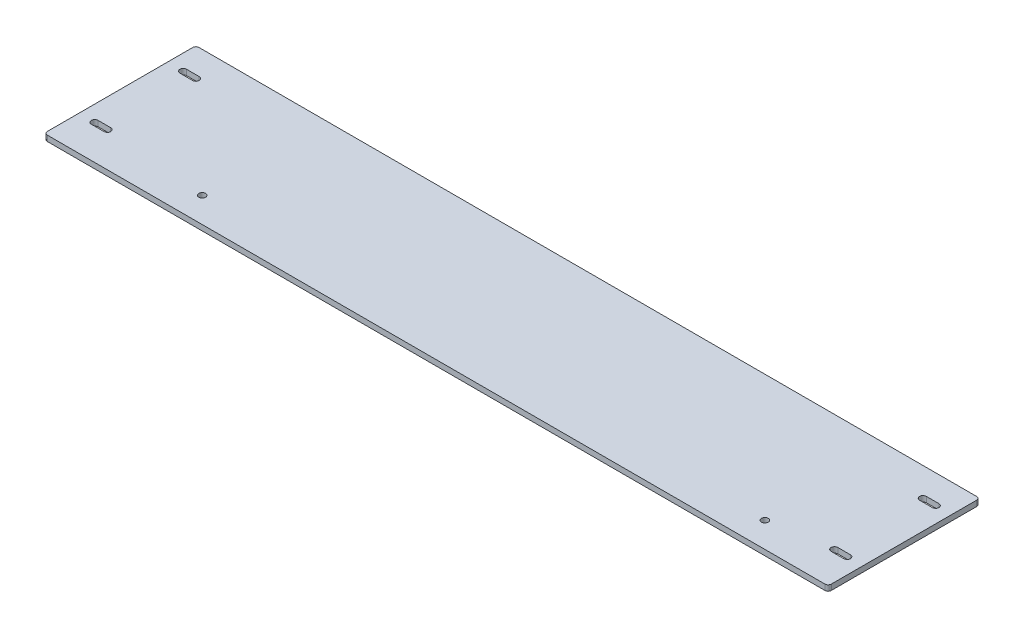
ISO-10303-21;
HEADER;
FILE_DESCRIPTION(('STEP AP214'),'2;1');
FILE_NAME('part.step','',(''),(''),'','','');
FILE_SCHEMA(('AUTOMOTIVE_DESIGN { 1 0 10303 214 1 1 1 1 }'));
ENDSEC;
DATA;
#1=APPLICATION_CONTEXT('core data for automotive mechanical design processes');
#2=APPLICATION_PROTOCOL_DEFINITION('international standard','automotive_design',2000,#1);
#3=PRODUCT_CONTEXT('',#1,'mechanical');
#4=PRODUCT('Part','Part','',(#3));
#5=PRODUCT_RELATED_PRODUCT_CATEGORY('part','',(#4));
#6=PRODUCT_DEFINITION_FORMATION('','',#4);
#7=PRODUCT_DEFINITION_CONTEXT('part definition',#1,'design');
#8=PRODUCT_DEFINITION('design','',#6,#7);
#9=PRODUCT_DEFINITION_SHAPE('','',#8);
#10=(LENGTH_UNIT() NAMED_UNIT(*) SI_UNIT(.MILLI.,.METRE.));
#11=(NAMED_UNIT(*) PLANE_ANGLE_UNIT() SI_UNIT($,.RADIAN.));
#12=(NAMED_UNIT(*) SI_UNIT($,.STERADIAN.) SOLID_ANGLE_UNIT());
#13=UNCERTAINTY_MEASURE_WITH_UNIT(LENGTH_MEASURE(1.E-05),#10,'distance_accuracy_value','');
#14=(GEOMETRIC_REPRESENTATION_CONTEXT(3) GLOBAL_UNCERTAINTY_ASSIGNED_CONTEXT((#13)) GLOBAL_UNIT_ASSIGNED_CONTEXT((#10,
#11,#12)) REPRESENTATION_CONTEXT('',''));
#15=CARTESIAN_POINT('',(0.,0.,0.));
#16=DIRECTION('',(0.,0.,1.));
#17=DIRECTION('',(1.,0.,0.));
#18=AXIS2_PLACEMENT_3D('',#15,#16,#17);
#19=CARTESIAN_POINT('',(0.,5.588,0.));
#20=DIRECTION('',(0.,-1.,0.));
#21=DIRECTION('',(0.,0.,-1.));
#22=AXIS2_PLACEMENT_3D('',#19,#20,#21);
#23=PLANE('',#22);
#24=CARTESIAN_POINT('',(133.35,5.588,-25.4));
#25=DIRECTION('',(0.,1.,0.));
#26=DIRECTION('',(0.,0.,1.));
#27=AXIS2_PLACEMENT_3D('',#24,#25,#26);
#28=CIRCLE('',#27,3.37819999999999);
#29=CARTESIAN_POINT('',(133.35,5.588,-22.0218));
#30=VERTEX_POINT('',#29);
#31=EDGE_CURVE('E851',#30,#30,#28,.T.);
#32=ORIENTED_EDGE('',*,*,#31,.F.);
#33=EDGE_LOOP('',(#32));
#34=FACE_BOUND('',#33,.T.);
#35=CARTESIAN_POINT('',(698.5,5.588,-25.4));
#36=DIRECTION('',(0.,1.,0.));
#37=DIRECTION('',(0.,0.,1.));
#38=AXIS2_PLACEMENT_3D('',#35,#36,#37);
#39=CIRCLE('',#38,3.37819999999999);
#40=CARTESIAN_POINT('',(698.5,5.588,-22.0218));
#41=VERTEX_POINT('',#40);
#42=EDGE_CURVE('E847',#41,#41,#39,.T.);
#43=ORIENTED_EDGE('',*,*,#42,.F.);
#44=EDGE_LOOP('',(#43));
#45=FACE_BOUND('',#44,.T.);
#46=CARTESIAN_POINT('',(771.525,5.588,-123.825));
#47=DIRECTION('',(0.,1.,0.));
#48=DIRECTION('',(0.,0.,1.));
#49=AXIS2_PLACEMENT_3D('',#46,#47,#48);
#50=CIRCLE('',#49,3.37819999999999);
#51=CARTESIAN_POINT('',(771.525,5.588,-120.4468));
#52=VERTEX_POINT('',#51);
#53=CARTESIAN_POINT('',(771.525,5.588,-127.2032));
#54=VERTEX_POINT('',#53);
#55=EDGE_CURVE('E257',#52,#54,#50,.T.);
#56=ORIENTED_EDGE('',*,*,#55,.F.);
#57=DIRECTION('',(1.,0.,0.));
#58=VECTOR('',#57,1.);
#59=CARTESIAN_POINT('',(771.525,5.588,-120.4468));
#60=LINE('',#59,#58);
#61=CARTESIAN_POINT('',(758.825,5.588,-120.4468));
#62=VERTEX_POINT('',#61);
#63=EDGE_CURVE('E268',#62,#52,#60,.T.);
#64=ORIENTED_EDGE('',*,*,#63,.F.);
#65=CARTESIAN_POINT('',(758.825,5.588,-123.825));
#66=DIRECTION('',(0.,1.,0.));
#67=DIRECTION('',(0.,0.,1.));
#68=AXIS2_PLACEMENT_3D('',#65,#66,#67);
#69=CIRCLE('',#68,3.37819999999999);
#70=CARTESIAN_POINT('',(758.825,5.588,-127.2032));
#71=VERTEX_POINT('',#70);
#72=EDGE_CURVE('E264',#71,#62,#69,.T.);
#73=ORIENTED_EDGE('',*,*,#72,.F.);
#74=DIRECTION('',(-1.,0.,0.));
#75=VECTOR('',#74,1.);
#76=CARTESIAN_POINT('',(771.525,5.588,-127.2032));
#77=LINE('',#76,#75);
#78=EDGE_CURVE('E260',#54,#71,#77,.T.);
#79=ORIENTED_EDGE('',*,*,#78,.F.);
#80=EDGE_LOOP('',(#56,#64,#73,#79));
#81=FACE_BOUND('',#80,.T.);
#82=CARTESIAN_POINT('',(15.875,5.588,-34.925));
#83=DIRECTION('',(0.,1.,0.));
#84=DIRECTION('',(0.,0.,1.));
#85=AXIS2_PLACEMENT_3D('',#82,#83,#84);
#86=CIRCLE('',#85,3.3782);
#87=CARTESIAN_POINT('',(15.875,5.588,-38.3032));
#88=VERTEX_POINT('',#87);
#89=CARTESIAN_POINT('',(15.875,5.588,-31.5468));
#90=VERTEX_POINT('',#89);
#91=EDGE_CURVE('E343',#88,#90,#86,.T.);
#92=ORIENTED_EDGE('',*,*,#91,.F.);
#93=DIRECTION('',(-1.,0.,0.));
#94=VECTOR('',#93,1.);
#95=CARTESIAN_POINT('',(15.875,5.588,-38.3032));
#96=LINE('',#95,#94);
#97=CARTESIAN_POINT('',(28.575,5.588,-38.3032));
#98=VERTEX_POINT('',#97);
#99=EDGE_CURVE('E354',#98,#88,#96,.T.);
#100=ORIENTED_EDGE('',*,*,#99,.F.);
#101=CARTESIAN_POINT('',(28.575,5.588,-34.925));
#102=DIRECTION('',(0.,1.,0.));
#103=DIRECTION('',(0.,0.,1.));
#104=AXIS2_PLACEMENT_3D('',#101,#102,#103);
#105=CIRCLE('',#104,3.3782);
#106=CARTESIAN_POINT('',(28.575,5.588,-31.5468));
#107=VERTEX_POINT('',#106);
#108=EDGE_CURVE('E350',#107,#98,#105,.T.);
#109=ORIENTED_EDGE('',*,*,#108,.F.);
#110=DIRECTION('',(1.,0.,0.));
#111=VECTOR('',#110,1.);
#112=CARTESIAN_POINT('',(15.875,5.588,-31.5468));
#113=LINE('',#112,#111);
#114=EDGE_CURVE('E346',#90,#107,#113,.T.);
#115=ORIENTED_EDGE('',*,*,#114,.F.);
#116=EDGE_LOOP('',(#92,#100,#109,#115));
#117=FACE_BOUND('',#116,.T.);
#118=DIRECTION('',(-1.,0.,0.));
#119=VECTOR('',#118,1.);
#120=CARTESIAN_POINT('',(0.,5.588,-152.4));
#121=LINE('',#120,#119);
#122=CARTESIAN_POINT('',(784.225,5.588,-152.4));
#123=VERTEX_POINT('',#122);
#124=CARTESIAN_POINT('',(3.175,5.588,-152.4));
#125=VERTEX_POINT('',#124);
#126=EDGE_CURVE('E397',#123,#125,#121,.T.);
#127=ORIENTED_EDGE('',*,*,#126,.T.);
#128=CARTESIAN_POINT('',(3.175,5.588,-149.225));
#129=DIRECTION('',(0.,-1.,0.));
#130=DIRECTION('',(0.,0.,-1.));
#131=AXIS2_PLACEMENT_3D('',#128,#129,#130);
#132=CIRCLE('',#131,3.175);
#133=CARTESIAN_POINT('',(0.,5.588,-149.225));
#134=VERTEX_POINT('',#133);
#135=EDGE_CURVE('E448',#125,#134,#132,.F.);
#136=ORIENTED_EDGE('',*,*,#135,.T.);
#137=DIRECTION('',(0.,0.,1.));
#138=VECTOR('',#137,1.);
#139=CARTESIAN_POINT('',(0.,5.588,0.));
#140=LINE('',#139,#138);
#141=CARTESIAN_POINT('',(0.,5.588,-3.175));
#142=VERTEX_POINT('',#141);
#143=EDGE_CURVE('E386',#134,#142,#140,.T.);
#144=ORIENTED_EDGE('',*,*,#143,.T.);
#145=CARTESIAN_POINT('',(3.175,5.588,-3.175));
#146=DIRECTION('',(0.,-1.,0.));
#147=DIRECTION('',(0.,0.,-1.));
#148=AXIS2_PLACEMENT_3D('',#145,#146,#147);
#149=CIRCLE('',#148,3.175);
#150=CARTESIAN_POINT('',(3.175,5.588,0.));
#151=VERTEX_POINT('',#150);
#152=EDGE_CURVE('E442',#142,#151,#149,.F.);
#153=ORIENTED_EDGE('',*,*,#152,.T.);
#154=DIRECTION('',(1.,0.,0.));
#155=VECTOR('',#154,1.);
#156=CARTESIAN_POINT('',(0.,5.588,0.));
#157=LINE('',#156,#155);
#158=CARTESIAN_POINT('',(784.225,5.588,0.));
#159=VERTEX_POINT('',#158);
#160=EDGE_CURVE('E390',#151,#159,#157,.T.);
#161=ORIENTED_EDGE('',*,*,#160,.T.);
#162=CARTESIAN_POINT('',(784.225,5.588,-3.175));
#163=DIRECTION('',(0.,-1.,0.));
#164=DIRECTION('',(0.,0.,-1.));
#165=AXIS2_PLACEMENT_3D('',#162,#163,#164);
#166=CIRCLE('',#165,3.175);
#167=CARTESIAN_POINT('',(787.4,5.588,-3.175));
#168=VERTEX_POINT('',#167);
#169=EDGE_CURVE('E59',#159,#168,#166,.F.);
#170=ORIENTED_EDGE('',*,*,#169,.T.);
#171=DIRECTION('',(0.,0.,-1.));
#172=VECTOR('',#171,1.);
#173=CARTESIAN_POINT('',(787.4,5.588,0.));
#174=LINE('',#173,#172);
#175=CARTESIAN_POINT('',(787.4,5.588,-149.225));
#176=VERTEX_POINT('',#175);
#177=EDGE_CURVE('E394',#168,#176,#174,.T.);
#178=ORIENTED_EDGE('',*,*,#177,.T.);
#179=CARTESIAN_POINT('',(784.225,5.588,-149.225));
#180=DIRECTION('',(0.,-1.,0.));
#181=DIRECTION('',(0.,0.,-1.));
#182=AXIS2_PLACEMENT_3D('',#179,#180,#181);
#183=CIRCLE('',#182,3.175);
#184=EDGE_CURVE('E445',#176,#123,#183,.F.);
#185=ORIENTED_EDGE('',*,*,#184,.T.);
#186=EDGE_LOOP('',(#127,#136,#144,#153,#161,#170,#178,#185));
#187=FACE_BOUND('',#186,.T.);
#188=CARTESIAN_POINT('',(15.875,5.588,-123.825));
#189=DIRECTION('',(0.,1.,0.));
#190=DIRECTION('',(0.,0.,1.));
#191=AXIS2_PLACEMENT_3D('',#188,#189,#190);
#192=CIRCLE('',#191,3.37819999999998);
#193=CARTESIAN_POINT('',(15.875,5.588,-127.2032));
#194=VERTEX_POINT('',#193);
#195=CARTESIAN_POINT('',(15.875,5.588,-120.4468));
#196=VERTEX_POINT('',#195);
#197=EDGE_CURVE('E300',#194,#196,#192,.T.);
#198=ORIENTED_EDGE('',*,*,#197,.F.);
#199=DIRECTION('',(-1.,0.,0.));
#200=VECTOR('',#199,1.);
#201=CARTESIAN_POINT('',(15.875,5.588,-127.2032));
#202=LINE('',#201,#200);
#203=CARTESIAN_POINT('',(28.575,5.588,-127.2032));
#204=VERTEX_POINT('',#203);
#205=EDGE_CURVE('E311',#204,#194,#202,.T.);
#206=ORIENTED_EDGE('',*,*,#205,.F.);
#207=CARTESIAN_POINT('',(28.575,5.588,-123.825));
#208=DIRECTION('',(0.,1.,0.));
#209=DIRECTION('',(0.,0.,1.));
#210=AXIS2_PLACEMENT_3D('',#207,#208,#209);
#211=CIRCLE('',#210,3.37819999999998);
#212=CARTESIAN_POINT('',(28.575,5.588,-120.4468));
#213=VERTEX_POINT('',#212);
#214=EDGE_CURVE('E307',#213,#204,#211,.T.);
#215=ORIENTED_EDGE('',*,*,#214,.F.);
#216=DIRECTION('',(1.,0.,0.));
#217=VECTOR('',#216,1.);
#218=CARTESIAN_POINT('',(15.875,5.588,-120.4468));
#219=LINE('',#218,#217);
#220=EDGE_CURVE('E303',#196,#213,#219,.T.);
#221=ORIENTED_EDGE('',*,*,#220,.F.);
#222=EDGE_LOOP('',(#198,#206,#215,#221));
#223=FACE_BOUND('',#222,.T.);
#224=CARTESIAN_POINT('',(771.525,5.588,-34.925));
#225=DIRECTION('',(0.,1.,0.));
#226=DIRECTION('',(0.,0.,1.));
#227=AXIS2_PLACEMENT_3D('',#224,#225,#226);
#228=CIRCLE('',#227,3.3782);
#229=CARTESIAN_POINT('',(771.525,5.588,-31.5468));
#230=VERTEX_POINT('',#229);
#231=CARTESIAN_POINT('',(771.525,5.588,-38.3032));
#232=VERTEX_POINT('',#231);
#233=EDGE_CURVE('E201',#230,#232,#228,.T.);
#234=ORIENTED_EDGE('',*,*,#233,.F.);
#235=DIRECTION('',(1.,0.,0.));
#236=VECTOR('',#235,1.);
#237=CARTESIAN_POINT('',(771.525,5.588,-31.5468));
#238=LINE('',#237,#236);
#239=CARTESIAN_POINT('',(758.825,5.588,-31.5468));
#240=VERTEX_POINT('',#239);
#241=EDGE_CURVE('E231',#240,#230,#238,.T.);
#242=ORIENTED_EDGE('',*,*,#241,.F.);
#243=CARTESIAN_POINT('',(758.825,5.588,-34.925));
#244=DIRECTION('',(0.,1.,0.));
#245=DIRECTION('',(0.,0.,1.));
#246=AXIS2_PLACEMENT_3D('',#243,#244,#245);
#247=CIRCLE('',#246,3.3782);
#248=CARTESIAN_POINT('',(758.825,5.588,-38.3032));
#249=VERTEX_POINT('',#248);
#250=EDGE_CURVE('E226',#249,#240,#247,.T.);
#251=ORIENTED_EDGE('',*,*,#250,.F.);
#252=DIRECTION('',(-1.,0.,0.));
#253=VECTOR('',#252,1.);
#254=CARTESIAN_POINT('',(771.525,5.588,-38.3032));
#255=LINE('',#254,#253);
#256=EDGE_CURVE('E212',#232,#249,#255,.T.);
#257=ORIENTED_EDGE('',*,*,#256,.F.);
#258=EDGE_LOOP('',(#234,#242,#251,#257));
#259=FACE_BOUND('',#258,.T.);
#260=ADVANCED_FACE('F36',(#34,#45,#81,#117,#187,#223,#259),#23,.F.);
#261=CARTESIAN_POINT('',(0.,0.,0.));
#262=DIRECTION('',(0.,-1.,0.));
#263=DIRECTION('',(0.,0.,-1.));
#264=AXIS2_PLACEMENT_3D('',#261,#262,#263);
#265=PLANE('',#264);
#266=CARTESIAN_POINT('',(133.35,0.,-25.4));
#267=DIRECTION('',(0.,1.,0.));
#268=DIRECTION('',(0.,0.,1.));
#269=AXIS2_PLACEMENT_3D('',#266,#267,#268);
#270=CIRCLE('',#269,3.37819999999999);
#271=CARTESIAN_POINT('',(133.35,0.,-22.0218));
#272=VERTEX_POINT('',#271);
#273=EDGE_CURVE('E240',#272,#272,#270,.T.);
#274=ORIENTED_EDGE('',*,*,#273,.T.);
#275=EDGE_LOOP('',(#274));
#276=FACE_BOUND('',#275,.T.);
#277=CARTESIAN_POINT('',(698.5,0.,-25.4));
#278=DIRECTION('',(0.,1.,0.));
#279=DIRECTION('',(0.,0.,1.));
#280=AXIS2_PLACEMENT_3D('',#277,#278,#279);
#281=CIRCLE('',#280,3.37819999999999);
#282=CARTESIAN_POINT('',(698.5,0.,-22.0218));
#283=VERTEX_POINT('',#282);
#284=EDGE_CURVE('E844',#283,#283,#281,.T.);
#285=ORIENTED_EDGE('',*,*,#284,.T.);
#286=EDGE_LOOP('',(#285));
#287=FACE_BOUND('',#286,.T.);
#288=DIRECTION('',(0.,0.,1.));
#289=VECTOR('',#288,1.);
#290=CARTESIAN_POINT('',(0.,0.,0.));
#291=LINE('',#290,#289);
#292=CARTESIAN_POINT('',(0.,0.,-149.225));
#293=VERTEX_POINT('',#292);
#294=CARTESIAN_POINT('',(0.,0.,-3.175));
#295=VERTEX_POINT('',#294);
#296=EDGE_CURVE('E385',#293,#295,#291,.T.);
#297=ORIENTED_EDGE('',*,*,#296,.F.);
#298=CARTESIAN_POINT('',(3.175,0.,-149.225));
#299=DIRECTION('',(0.,-1.,0.));
#300=DIRECTION('',(0.,0.,-1.));
#301=AXIS2_PLACEMENT_3D('',#298,#299,#300);
#302=CIRCLE('',#301,3.175);
#303=CARTESIAN_POINT('',(3.175,0.,-152.4));
#304=VERTEX_POINT('',#303);
#305=EDGE_CURVE('E430',#293,#304,#302,.T.);
#306=ORIENTED_EDGE('',*,*,#305,.T.);
#307=DIRECTION('',(-1.,0.,0.));
#308=VECTOR('',#307,1.);
#309=CARTESIAN_POINT('',(0.,0.,-152.4));
#310=LINE('',#309,#308);
#311=CARTESIAN_POINT('',(784.225,0.,-152.4));
#312=VERTEX_POINT('',#311);
#313=EDGE_CURVE('E391',#312,#304,#310,.T.);
#314=ORIENTED_EDGE('',*,*,#313,.F.);
#315=CARTESIAN_POINT('',(784.225,0.,-149.225));
#316=DIRECTION('',(0.,-1.,0.));
#317=DIRECTION('',(0.,0.,-1.));
#318=AXIS2_PLACEMENT_3D('',#315,#316,#317);
#319=CIRCLE('',#318,3.175);
#320=CARTESIAN_POINT('',(787.4,0.,-149.225));
#321=VERTEX_POINT('',#320);
#322=EDGE_CURVE('E427',#312,#321,#319,.T.);
#323=ORIENTED_EDGE('',*,*,#322,.T.);
#324=DIRECTION('',(0.,0.,-1.));
#325=VECTOR('',#324,1.);
#326=CARTESIAN_POINT('',(787.4,0.,0.));
#327=LINE('',#326,#325);
#328=CARTESIAN_POINT('',(787.4,0.,-3.175));
#329=VERTEX_POINT('',#328);
#330=EDGE_CURVE('E409',#329,#321,#327,.T.);
#331=ORIENTED_EDGE('',*,*,#330,.F.);
#332=CARTESIAN_POINT('',(784.225,0.,-3.175));
#333=DIRECTION('',(0.,-1.,0.));
#334=DIRECTION('',(0.,0.,-1.));
#335=AXIS2_PLACEMENT_3D('',#332,#333,#334);
#336=CIRCLE('',#335,3.175);
#337=CARTESIAN_POINT('',(784.225,0.,0.));
#338=VERTEX_POINT('',#337);
#339=EDGE_CURVE('E421',#329,#338,#336,.T.);
#340=ORIENTED_EDGE('',*,*,#339,.T.);
#341=DIRECTION('',(1.,0.,0.));
#342=VECTOR('',#341,1.);
#343=CARTESIAN_POINT('',(0.,0.,0.));
#344=LINE('',#343,#342);
#345=CARTESIAN_POINT('',(3.175,0.,0.));
#346=VERTEX_POINT('',#345);
#347=EDGE_CURVE('E405',#346,#338,#344,.T.);
#348=ORIENTED_EDGE('',*,*,#347,.F.);
#349=CARTESIAN_POINT('',(3.175,0.,-3.175));
#350=DIRECTION('',(0.,-1.,0.));
#351=DIRECTION('',(0.,0.,-1.));
#352=AXIS2_PLACEMENT_3D('',#349,#350,#351);
#353=CIRCLE('',#352,3.175);
#354=EDGE_CURVE('E424',#346,#295,#353,.T.);
#355=ORIENTED_EDGE('',*,*,#354,.T.);
#356=EDGE_LOOP('',(#297,#306,#314,#323,#331,#340,#348,#355));
#357=FACE_BOUND('',#356,.T.);
#358=DIRECTION('',(-1.,0.,0.));
#359=VECTOR('',#358,1.);
#360=CARTESIAN_POINT('',(15.875,0.,-38.3032));
#361=LINE('',#360,#359);
#362=CARTESIAN_POINT('',(28.575,0.,-38.3032));
#363=VERTEX_POINT('',#362);
#364=CARTESIAN_POINT('',(15.875,0.,-38.3032));
#365=VERTEX_POINT('',#364);
#366=EDGE_CURVE('E347',#363,#365,#361,.T.);
#367=ORIENTED_EDGE('',*,*,#366,.T.);
#368=CARTESIAN_POINT('',(15.875,0.,-34.925));
#369=DIRECTION('',(0.,1.,0.));
#370=DIRECTION('',(0.,0.,1.));
#371=AXIS2_PLACEMENT_3D('',#368,#369,#370);
#372=CIRCLE('',#371,3.3782);
#373=CARTESIAN_POINT('',(15.875,0.,-31.5468));
#374=VERTEX_POINT('',#373);
#375=EDGE_CURVE('E342',#365,#374,#372,.T.);
#376=ORIENTED_EDGE('',*,*,#375,.T.);
#377=DIRECTION('',(1.,0.,0.));
#378=VECTOR('',#377,1.);
#379=CARTESIAN_POINT('',(15.875,0.,-31.5468));
#380=LINE('',#379,#378);
#381=CARTESIAN_POINT('',(28.575,0.,-31.5468));
#382=VERTEX_POINT('',#381);
#383=EDGE_CURVE('E361',#374,#382,#380,.T.);
#384=ORIENTED_EDGE('',*,*,#383,.T.);
#385=CARTESIAN_POINT('',(28.575,0.,-34.925));
#386=DIRECTION('',(0.,1.,0.));
#387=DIRECTION('',(0.,0.,1.));
#388=AXIS2_PLACEMENT_3D('',#385,#386,#387);
#389=CIRCLE('',#388,3.3782);
#390=EDGE_CURVE('E365',#382,#363,#389,.T.);
#391=ORIENTED_EDGE('',*,*,#390,.T.);
#392=EDGE_LOOP('',(#367,#376,#384,#391));
#393=FACE_BOUND('',#392,.T.);
#394=DIRECTION('',(-1.,0.,0.));
#395=VECTOR('',#394,1.);
#396=CARTESIAN_POINT('',(15.875,0.,-127.2032));
#397=LINE('',#396,#395);
#398=CARTESIAN_POINT('',(28.575,0.,-127.2032));
#399=VERTEX_POINT('',#398);
#400=CARTESIAN_POINT('',(15.875,0.,-127.2032));
#401=VERTEX_POINT('',#400);
#402=EDGE_CURVE('E304',#399,#401,#397,.T.);
#403=ORIENTED_EDGE('',*,*,#402,.T.);
#404=CARTESIAN_POINT('',(15.875,0.,-123.825));
#405=DIRECTION('',(0.,1.,0.));
#406=DIRECTION('',(0.,0.,1.));
#407=AXIS2_PLACEMENT_3D('',#404,#405,#406);
#408=CIRCLE('',#407,3.37819999999998);
#409=CARTESIAN_POINT('',(15.875,0.,-120.4468));
#410=VERTEX_POINT('',#409);
#411=EDGE_CURVE('E299',#401,#410,#408,.T.);
#412=ORIENTED_EDGE('',*,*,#411,.T.);
#413=DIRECTION('',(1.,0.,0.));
#414=VECTOR('',#413,1.);
#415=CARTESIAN_POINT('',(15.875,0.,-120.4468));
#416=LINE('',#415,#414);
#417=CARTESIAN_POINT('',(28.575,0.,-120.4468));
#418=VERTEX_POINT('',#417);
#419=EDGE_CURVE('E318',#410,#418,#416,.T.);
#420=ORIENTED_EDGE('',*,*,#419,.T.);
#421=CARTESIAN_POINT('',(28.575,0.,-123.825));
#422=DIRECTION('',(0.,1.,0.));
#423=DIRECTION('',(0.,0.,1.));
#424=AXIS2_PLACEMENT_3D('',#421,#422,#423);
#425=CIRCLE('',#424,3.37819999999998);
#426=EDGE_CURVE('E322',#418,#399,#425,.T.);
#427=ORIENTED_EDGE('',*,*,#426,.T.);
#428=EDGE_LOOP('',(#403,#412,#420,#427));
#429=FACE_BOUND('',#428,.T.);
#430=DIRECTION('',(1.,0.,0.));
#431=VECTOR('',#430,1.);
#432=CARTESIAN_POINT('',(771.525,0.,-120.4468));
#433=LINE('',#432,#431);
#434=CARTESIAN_POINT('',(758.825,0.,-120.4468));
#435=VERTEX_POINT('',#434);
#436=CARTESIAN_POINT('',(771.525,0.,-120.4468));
#437=VERTEX_POINT('',#436);
#438=EDGE_CURVE('E261',#435,#437,#433,.T.);
#439=ORIENTED_EDGE('',*,*,#438,.T.);
#440=CARTESIAN_POINT('',(771.525,0.,-123.825));
#441=DIRECTION('',(0.,1.,0.));
#442=DIRECTION('',(0.,0.,1.));
#443=AXIS2_PLACEMENT_3D('',#440,#441,#442);
#444=CIRCLE('',#443,3.37819999999999);
#445=CARTESIAN_POINT('',(771.525,0.,-127.2032));
#446=VERTEX_POINT('',#445);
#447=EDGE_CURVE('E221',#437,#446,#444,.T.);
#448=ORIENTED_EDGE('',*,*,#447,.T.);
#449=DIRECTION('',(-1.,0.,0.));
#450=VECTOR('',#449,1.);
#451=CARTESIAN_POINT('',(771.525,0.,-127.2032));
#452=LINE('',#451,#450);
#453=CARTESIAN_POINT('',(758.825,0.,-127.2032));
#454=VERTEX_POINT('',#453);
#455=EDGE_CURVE('E275',#446,#454,#452,.T.);
#456=ORIENTED_EDGE('',*,*,#455,.T.);
#457=CARTESIAN_POINT('',(758.825,0.,-123.825));
#458=DIRECTION('',(0.,1.,0.));
#459=DIRECTION('',(0.,0.,1.));
#460=AXIS2_PLACEMENT_3D('',#457,#458,#459);
#461=CIRCLE('',#460,3.37819999999999);
#462=EDGE_CURVE('E279',#454,#435,#461,.T.);
#463=ORIENTED_EDGE('',*,*,#462,.T.);
#464=EDGE_LOOP('',(#439,#448,#456,#463));
#465=FACE_BOUND('',#464,.T.);
#466=DIRECTION('',(1.,0.,0.));
#467=VECTOR('',#466,1.);
#468=CARTESIAN_POINT('',(771.525,0.,-31.5468));
#469=LINE('',#468,#467);
#470=CARTESIAN_POINT('',(758.825,0.,-31.5468));
#471=VERTEX_POINT('',#470);
#472=CARTESIAN_POINT('',(771.525,0.,-31.5468));
#473=VERTEX_POINT('',#472);
#474=EDGE_CURVE('E213',#471,#473,#469,.T.);
#475=ORIENTED_EDGE('',*,*,#474,.T.);
#476=CARTESIAN_POINT('',(771.525,0.,-34.925));
#477=DIRECTION('',(0.,1.,0.));
#478=DIRECTION('',(0.,0.,1.));
#479=AXIS2_PLACEMENT_3D('',#476,#477,#478);
#480=CIRCLE('',#479,3.3782);
#481=CARTESIAN_POINT('',(771.525,0.,-38.3032));
#482=VERTEX_POINT('',#481);
#483=EDGE_CURVE('E237',#473,#482,#480,.T.);
#484=ORIENTED_EDGE('',*,*,#483,.T.);
#485=DIRECTION('',(-1.,0.,0.));
#486=VECTOR('',#485,1.);
#487=CARTESIAN_POINT('',(771.525,0.,-38.3032));
#488=LINE('',#487,#486);
#489=CARTESIAN_POINT('',(758.825,0.,-38.3032));
#490=VERTEX_POINT('',#489);
#491=EDGE_CURVE('E219',#482,#490,#488,.T.);
#492=ORIENTED_EDGE('',*,*,#491,.T.);
#493=CARTESIAN_POINT('',(758.825,0.,-34.925));
#494=DIRECTION('',(0.,1.,0.));
#495=DIRECTION('',(0.,0.,1.));
#496=AXIS2_PLACEMENT_3D('',#493,#494,#495);
#497=CIRCLE('',#496,3.3782);
#498=EDGE_CURVE('E243',#490,#471,#497,.T.);
#499=ORIENTED_EDGE('',*,*,#498,.T.);
#500=EDGE_LOOP('',(#475,#484,#492,#499));
#501=FACE_BOUND('',#500,.T.);
#502=ADVANCED_FACE('F472',(#276,#287,#357,#393,#429,#465,#501),#265,.T.);
#503=CARTESIAN_POINT('',(0.,5.588,0.));
#504=DIRECTION('',(1.,0.,0.));
#505=DIRECTION('',(0.,0.,-1.));
#506=AXIS2_PLACEMENT_3D('',#503,#504,#505);
#507=PLANE('',#506);
#508=ORIENTED_EDGE('',*,*,#143,.F.);
#509=DIRECTION('',(0.,-1.,0.));
#510=VECTOR('',#509,1.);
#511=CARTESIAN_POINT('',(0.,5.588,-149.225));
#512=LINE('',#511,#510);
#513=EDGE_CURVE('E417',#134,#293,#512,.T.);
#514=ORIENTED_EDGE('',*,*,#513,.T.);
#515=ORIENTED_EDGE('',*,*,#296,.T.);
#516=DIRECTION('',(0.,-1.,0.));
#517=VECTOR('',#516,1.);
#518=CARTESIAN_POINT('',(0.,5.588,-3.175));
#519=LINE('',#518,#517);
#520=EDGE_CURVE('E401',#295,#142,#519,.F.);
#521=ORIENTED_EDGE('',*,*,#520,.T.);
#522=EDGE_LOOP('',(#508,#514,#515,#521));
#523=FACE_BOUND('',#522,.T.);
#524=ADVANCED_FACE('F489',(#523),#507,.F.);
#525=CARTESIAN_POINT('',(0.,5.588,0.));
#526=DIRECTION('',(0.,0.,-1.));
#527=DIRECTION('',(-1.,0.,0.));
#528=AXIS2_PLACEMENT_3D('',#525,#526,#527);
#529=PLANE('',#528);
#530=ORIENTED_EDGE('',*,*,#160,.F.);
#531=DIRECTION('',(0.,-1.,0.));
#532=VECTOR('',#531,1.);
#533=CARTESIAN_POINT('',(3.175,5.588,0.));
#534=LINE('',#533,#532);
#535=EDGE_CURVE('E11',#151,#346,#534,.T.);
#536=ORIENTED_EDGE('',*,*,#535,.T.);
#537=ORIENTED_EDGE('',*,*,#347,.T.);
#538=DIRECTION('',(0.,-1.,0.));
#539=VECTOR('',#538,1.);
#540=CARTESIAN_POINT('',(784.225,5.588,0.));
#541=LINE('',#540,#539);
#542=EDGE_CURVE('E45',#338,#159,#541,.F.);
#543=ORIENTED_EDGE('',*,*,#542,.T.);
#544=EDGE_LOOP('',(#530,#536,#537,#543));
#545=FACE_BOUND('',#544,.T.);
#546=ADVANCED_FACE('F461',(#545),#529,.F.);
#547=CARTESIAN_POINT('',(787.4,5.588,0.));
#548=DIRECTION('',(-1.,0.,0.));
#549=DIRECTION('',(0.,0.,1.));
#550=AXIS2_PLACEMENT_3D('',#547,#548,#549);
#551=PLANE('',#550);
#552=ORIENTED_EDGE('',*,*,#330,.T.);
#553=DIRECTION('',(0.,-1.,0.));
#554=VECTOR('',#553,1.);
#555=CARTESIAN_POINT('',(787.4,5.588,-149.225));
#556=LINE('',#555,#554);
#557=EDGE_CURVE('E52',#321,#176,#556,.F.);
#558=ORIENTED_EDGE('',*,*,#557,.T.);
#559=ORIENTED_EDGE('',*,*,#177,.F.);
#560=DIRECTION('',(0.,-1.,0.));
#561=VECTOR('',#560,1.);
#562=CARTESIAN_POINT('',(787.4,5.588,-3.175));
#563=LINE('',#562,#561);
#564=EDGE_CURVE('E451',#168,#329,#563,.T.);
#565=ORIENTED_EDGE('',*,*,#564,.T.);
#566=EDGE_LOOP('',(#552,#558,#559,#565));
#567=FACE_BOUND('',#566,.T.);
#568=ADVANCED_FACE('F469',(#567),#551,.F.);
#569=CARTESIAN_POINT('',(0.,5.588,-152.4));
#570=DIRECTION('',(0.,0.,1.));
#571=DIRECTION('',(1.,0.,0.));
#572=AXIS2_PLACEMENT_3D('',#569,#570,#571);
#573=PLANE('',#572);
#574=ORIENTED_EDGE('',*,*,#313,.T.);
#575=DIRECTION('',(0.,-1.,0.));
#576=VECTOR('',#575,1.);
#577=CARTESIAN_POINT('',(3.175,5.588,-152.4));
#578=LINE('',#577,#576);
#579=EDGE_CURVE('E437',#304,#125,#578,.F.);
#580=ORIENTED_EDGE('',*,*,#579,.T.);
#581=ORIENTED_EDGE('',*,*,#126,.F.);
#582=DIRECTION('',(0.,-1.,0.));
#583=VECTOR('',#582,1.);
#584=CARTESIAN_POINT('',(784.225,5.588,-152.4));
#585=LINE('',#584,#583);
#586=EDGE_CURVE('E433',#123,#312,#585,.T.);
#587=ORIENTED_EDGE('',*,*,#586,.T.);
#588=EDGE_LOOP('',(#574,#580,#581,#587));
#589=FACE_BOUND('',#588,.T.);
#590=ADVANCED_FACE('F481',(#589),#573,.F.);
#591=CARTESIAN_POINT('',(15.875,5.588,-34.925));
#592=DIRECTION('',(0.,-1.,0.));
#593=DIRECTION('',(0.,0.,-1.));
#594=AXIS2_PLACEMENT_3D('',#591,#592,#593);
#595=CYLINDRICAL_SURFACE('',#594,3.3782);
#596=ORIENTED_EDGE('',*,*,#375,.F.);
#597=DIRECTION('',(0.,-1.,0.));
#598=VECTOR('',#597,1.);
#599=CARTESIAN_POINT('',(15.875,5.588,-38.3032));
#600=LINE('',#599,#598);
#601=EDGE_CURVE('E357',#88,#365,#600,.T.);
#602=ORIENTED_EDGE('',*,*,#601,.F.);
#603=ORIENTED_EDGE('',*,*,#91,.T.);
#604=DIRECTION('',(0.,-1.,0.));
#605=VECTOR('',#604,1.);
#606=CARTESIAN_POINT('',(15.875,5.588,-31.5468));
#607=LINE('',#606,#605);
#608=EDGE_CURVE('E381',#90,#374,#607,.T.);
#609=ORIENTED_EDGE('',*,*,#608,.T.);
#610=EDGE_LOOP('',(#596,#602,#603,#609));
#611=FACE_BOUND('',#610,.T.);
#612=ADVANCED_FACE('F511',(#611),#595,.F.);
#613=CARTESIAN_POINT('',(15.875,5.588,-31.5468));
#614=DIRECTION('',(0.,0.,-1.));
#615=DIRECTION('',(-1.,0.,0.));
#616=AXIS2_PLACEMENT_3D('',#613,#614,#615);
#617=PLANE('',#616);
#618=ORIENTED_EDGE('',*,*,#383,.F.);
#619=ORIENTED_EDGE('',*,*,#608,.F.);
#620=ORIENTED_EDGE('',*,*,#114,.T.);
#621=DIRECTION('',(0.,-1.,0.));
#622=VECTOR('',#621,1.);
#623=CARTESIAN_POINT('',(28.575,5.588,-31.5468));
#624=LINE('',#623,#622);
#625=EDGE_CURVE('E378',#107,#382,#624,.T.);
#626=ORIENTED_EDGE('',*,*,#625,.T.);
#627=EDGE_LOOP('',(#618,#619,#620,#626));
#628=FACE_BOUND('',#627,.T.);
#629=ADVANCED_FACE('F581',(#628),#617,.T.);
#630=CARTESIAN_POINT('',(28.575,5.588,-34.925));
#631=DIRECTION('',(0.,-1.,0.));
#632=DIRECTION('',(0.,0.,-1.));
#633=AXIS2_PLACEMENT_3D('',#630,#631,#632);
#634=CYLINDRICAL_SURFACE('',#633,3.3782);
#635=ORIENTED_EDGE('',*,*,#390,.F.);
#636=ORIENTED_EDGE('',*,*,#625,.F.);
#637=ORIENTED_EDGE('',*,*,#108,.T.);
#638=DIRECTION('',(0.,-1.,0.));
#639=VECTOR('',#638,1.);
#640=CARTESIAN_POINT('',(28.575,5.588,-38.3032));
#641=LINE('',#640,#639);
#642=EDGE_CURVE('E375',#98,#363,#641,.T.);
#643=ORIENTED_EDGE('',*,*,#642,.T.);
#644=EDGE_LOOP('',(#635,#636,#637,#643));
#645=FACE_BOUND('',#644,.T.);
#646=ADVANCED_FACE('F578',(#645),#634,.F.);
#647=CARTESIAN_POINT('',(15.875,5.588,-38.3032));
#648=DIRECTION('',(0.,0.,1.));
#649=DIRECTION('',(1.,0.,0.));
#650=AXIS2_PLACEMENT_3D('',#647,#648,#649);
#651=PLANE('',#650);
#652=ORIENTED_EDGE('',*,*,#366,.F.);
#653=ORIENTED_EDGE('',*,*,#642,.F.);
#654=ORIENTED_EDGE('',*,*,#99,.T.);
#655=ORIENTED_EDGE('',*,*,#601,.T.);
#656=EDGE_LOOP('',(#652,#653,#654,#655));
#657=FACE_BOUND('',#656,.T.);
#658=ADVANCED_FACE('F574',(#657),#651,.T.);
#659=CARTESIAN_POINT('',(15.875,5.588,-123.825));
#660=DIRECTION('',(0.,-1.,0.));
#661=DIRECTION('',(0.,0.,-1.));
#662=AXIS2_PLACEMENT_3D('',#659,#660,#661);
#663=CYLINDRICAL_SURFACE('',#662,3.37819999999998);
#664=ORIENTED_EDGE('',*,*,#411,.F.);
#665=DIRECTION('',(0.,-1.,0.));
#666=VECTOR('',#665,1.);
#667=CARTESIAN_POINT('',(15.875,5.588,-127.2032));
#668=LINE('',#667,#666);
#669=EDGE_CURVE('E314',#194,#401,#668,.T.);
#670=ORIENTED_EDGE('',*,*,#669,.F.);
#671=ORIENTED_EDGE('',*,*,#197,.T.);
#672=DIRECTION('',(0.,-1.,0.));
#673=VECTOR('',#672,1.);
#674=CARTESIAN_POINT('',(15.875,5.588,-120.4468));
#675=LINE('',#674,#673);
#676=EDGE_CURVE('E338',#196,#410,#675,.T.);
#677=ORIENTED_EDGE('',*,*,#676,.T.);
#678=EDGE_LOOP('',(#664,#670,#671,#677));
#679=FACE_BOUND('',#678,.T.);
#680=ADVANCED_FACE('F570',(#679),#663,.F.);
#681=CARTESIAN_POINT('',(15.875,5.588,-120.4468));
#682=DIRECTION('',(0.,0.,-1.));
#683=DIRECTION('',(-1.,0.,0.));
#684=AXIS2_PLACEMENT_3D('',#681,#682,#683);
#685=PLANE('',#684);
#686=ORIENTED_EDGE('',*,*,#419,.F.);
#687=ORIENTED_EDGE('',*,*,#676,.F.);
#688=ORIENTED_EDGE('',*,*,#220,.T.);
#689=DIRECTION('',(0.,-1.,0.));
#690=VECTOR('',#689,1.);
#691=CARTESIAN_POINT('',(28.575,5.588,-120.4468));
#692=LINE('',#691,#690);
#693=EDGE_CURVE('E335',#213,#418,#692,.T.);
#694=ORIENTED_EDGE('',*,*,#693,.T.);
#695=EDGE_LOOP('',(#686,#687,#688,#694));
#696=FACE_BOUND('',#695,.T.);
#697=ADVANCED_FACE('F566',(#696),#685,.T.);
#698=CARTESIAN_POINT('',(28.575,5.588,-123.825));
#699=DIRECTION('',(0.,-1.,0.));
#700=DIRECTION('',(0.,0.,-1.));
#701=AXIS2_PLACEMENT_3D('',#698,#699,#700);
#702=CYLINDRICAL_SURFACE('',#701,3.37819999999998);
#703=ORIENTED_EDGE('',*,*,#426,.F.);
#704=ORIENTED_EDGE('',*,*,#693,.F.);
#705=ORIENTED_EDGE('',*,*,#214,.T.);
#706=DIRECTION('',(0.,-1.,0.));
#707=VECTOR('',#706,1.);
#708=CARTESIAN_POINT('',(28.575,5.588,-127.2032));
#709=LINE('',#708,#707);
#710=EDGE_CURVE('E332',#204,#399,#709,.T.);
#711=ORIENTED_EDGE('',*,*,#710,.T.);
#712=EDGE_LOOP('',(#703,#704,#705,#711));
#713=FACE_BOUND('',#712,.T.);
#714=ADVANCED_FACE('F562',(#713),#702,.F.);
#715=CARTESIAN_POINT('',(15.875,5.588,-127.2032));
#716=DIRECTION('',(0.,0.,1.));
#717=DIRECTION('',(1.,0.,0.));
#718=AXIS2_PLACEMENT_3D('',#715,#716,#717);
#719=PLANE('',#718);
#720=ORIENTED_EDGE('',*,*,#402,.F.);
#721=ORIENTED_EDGE('',*,*,#710,.F.);
#722=ORIENTED_EDGE('',*,*,#205,.T.);
#723=ORIENTED_EDGE('',*,*,#669,.T.);
#724=EDGE_LOOP('',(#720,#721,#722,#723));
#725=FACE_BOUND('',#724,.T.);
#726=ADVANCED_FACE('F558',(#725),#719,.T.);
#727=CARTESIAN_POINT('',(771.525,5.588,-123.825));
#728=DIRECTION('',(0.,-1.,0.));
#729=DIRECTION('',(0.,0.,-1.));
#730=AXIS2_PLACEMENT_3D('',#727,#728,#729);
#731=CYLINDRICAL_SURFACE('',#730,3.37819999999999);
#732=ORIENTED_EDGE('',*,*,#447,.F.);
#733=DIRECTION('',(0.,-1.,0.));
#734=VECTOR('',#733,1.);
#735=CARTESIAN_POINT('',(771.525,5.588,-120.4468));
#736=LINE('',#735,#734);
#737=EDGE_CURVE('E271',#52,#437,#736,.T.);
#738=ORIENTED_EDGE('',*,*,#737,.F.);
#739=ORIENTED_EDGE('',*,*,#55,.T.);
#740=DIRECTION('',(0.,-1.,0.));
#741=VECTOR('',#740,1.);
#742=CARTESIAN_POINT('',(771.525,5.588,-127.2032));
#743=LINE('',#742,#741);
#744=EDGE_CURVE('E295',#54,#446,#743,.T.);
#745=ORIENTED_EDGE('',*,*,#744,.T.);
#746=EDGE_LOOP('',(#732,#738,#739,#745));
#747=FACE_BOUND('',#746,.T.);
#748=ADVANCED_FACE('F554',(#747),#731,.F.);
#749=CARTESIAN_POINT('',(771.525,5.588,-127.2032));
#750=DIRECTION('',(0.,0.,1.));
#751=DIRECTION('',(1.,0.,0.));
#752=AXIS2_PLACEMENT_3D('',#749,#750,#751);
#753=PLANE('',#752);
#754=ORIENTED_EDGE('',*,*,#455,.F.);
#755=ORIENTED_EDGE('',*,*,#744,.F.);
#756=ORIENTED_EDGE('',*,*,#78,.T.);
#757=DIRECTION('',(0.,-1.,0.));
#758=VECTOR('',#757,1.);
#759=CARTESIAN_POINT('',(758.825,5.588,-127.2032));
#760=LINE('',#759,#758);
#761=EDGE_CURVE('E292',#71,#454,#760,.T.);
#762=ORIENTED_EDGE('',*,*,#761,.T.);
#763=EDGE_LOOP('',(#754,#755,#756,#762));
#764=FACE_BOUND('',#763,.T.);
#765=ADVANCED_FACE('F550',(#764),#753,.T.);
#766=CARTESIAN_POINT('',(758.825,5.588,-123.825));
#767=DIRECTION('',(0.,-1.,0.));
#768=DIRECTION('',(0.,0.,-1.));
#769=AXIS2_PLACEMENT_3D('',#766,#767,#768);
#770=CYLINDRICAL_SURFACE('',#769,3.37819999999999);
#771=ORIENTED_EDGE('',*,*,#462,.F.);
#772=ORIENTED_EDGE('',*,*,#761,.F.);
#773=ORIENTED_EDGE('',*,*,#72,.T.);
#774=DIRECTION('',(0.,-1.,0.));
#775=VECTOR('',#774,1.);
#776=CARTESIAN_POINT('',(758.825,5.588,-120.4468));
#777=LINE('',#776,#775);
#778=EDGE_CURVE('E289',#62,#435,#777,.T.);
#779=ORIENTED_EDGE('',*,*,#778,.T.);
#780=EDGE_LOOP('',(#771,#772,#773,#779));
#781=FACE_BOUND('',#780,.T.);
#782=ADVANCED_FACE('F546',(#781),#770,.F.);
#783=CARTESIAN_POINT('',(771.525,5.588,-120.4468));
#784=DIRECTION('',(0.,0.,-1.));
#785=DIRECTION('',(-1.,0.,0.));
#786=AXIS2_PLACEMENT_3D('',#783,#784,#785);
#787=PLANE('',#786);
#788=ORIENTED_EDGE('',*,*,#438,.F.);
#789=ORIENTED_EDGE('',*,*,#778,.F.);
#790=ORIENTED_EDGE('',*,*,#63,.T.);
#791=ORIENTED_EDGE('',*,*,#737,.T.);
#792=EDGE_LOOP('',(#788,#789,#790,#791));
#793=FACE_BOUND('',#792,.T.);
#794=ADVANCED_FACE('F543',(#793),#787,.T.);
#795=CARTESIAN_POINT('',(771.525,5.588,-34.925));
#796=DIRECTION('',(0.,-1.,0.));
#797=DIRECTION('',(0.,0.,-1.));
#798=AXIS2_PLACEMENT_3D('',#795,#796,#797);
#799=CYLINDRICAL_SURFACE('',#798,3.3782);
#800=ORIENTED_EDGE('',*,*,#483,.F.);
#801=DIRECTION('',(0.,-1.,0.));
#802=VECTOR('',#801,1.);
#803=CARTESIAN_POINT('',(771.525,5.588,-31.5468));
#804=LINE('',#803,#802);
#805=EDGE_CURVE('E207',#230,#473,#804,.T.);
#806=ORIENTED_EDGE('',*,*,#805,.F.);
#807=ORIENTED_EDGE('',*,*,#233,.T.);
#808=DIRECTION('',(0.,-1.,0.));
#809=VECTOR('',#808,1.);
#810=CARTESIAN_POINT('',(771.525,5.588,-38.3032));
#811=LINE('',#810,#809);
#812=EDGE_CURVE('E204',#232,#482,#811,.T.);
#813=ORIENTED_EDGE('',*,*,#812,.T.);
#814=EDGE_LOOP('',(#800,#806,#807,#813));
#815=FACE_BOUND('',#814,.T.);
#816=ADVANCED_FACE('F203',(#815),#799,.F.);
#817=CARTESIAN_POINT('',(771.525,5.588,-38.3032));
#818=DIRECTION('',(0.,0.,1.));
#819=DIRECTION('',(1.,0.,0.));
#820=AXIS2_PLACEMENT_3D('',#817,#818,#819);
#821=PLANE('',#820);
#822=ORIENTED_EDGE('',*,*,#491,.F.);
#823=ORIENTED_EDGE('',*,*,#812,.F.);
#824=ORIENTED_EDGE('',*,*,#256,.T.);
#825=DIRECTION('',(0.,-1.,0.));
#826=VECTOR('',#825,1.);
#827=CARTESIAN_POINT('',(758.825,5.588,-38.3032));
#828=LINE('',#827,#826);
#829=EDGE_CURVE('E222',#249,#490,#828,.T.);
#830=ORIENTED_EDGE('',*,*,#829,.T.);
#831=EDGE_LOOP('',(#822,#823,#824,#830));
#832=FACE_BOUND('',#831,.T.);
#833=ADVANCED_FACE('F216',(#832),#821,.T.);
#834=CARTESIAN_POINT('',(758.825,5.588,-34.925));
#835=DIRECTION('',(0.,-1.,0.));
#836=DIRECTION('',(0.,0.,-1.));
#837=AXIS2_PLACEMENT_3D('',#834,#835,#836);
#838=CYLINDRICAL_SURFACE('',#837,3.3782);
#839=ORIENTED_EDGE('',*,*,#498,.F.);
#840=ORIENTED_EDGE('',*,*,#829,.F.);
#841=ORIENTED_EDGE('',*,*,#250,.T.);
#842=DIRECTION('',(0.,-1.,0.));
#843=VECTOR('',#842,1.);
#844=CARTESIAN_POINT('',(758.825,5.588,-31.5468));
#845=LINE('',#844,#843);
#846=EDGE_CURVE('E252',#240,#471,#845,.T.);
#847=ORIENTED_EDGE('',*,*,#846,.T.);
#848=EDGE_LOOP('',(#839,#840,#841,#847));
#849=FACE_BOUND('',#848,.T.);
#850=ADVANCED_FACE('F527',(#849),#838,.F.);
#851=CARTESIAN_POINT('',(771.525,5.588,-31.5468));
#852=DIRECTION('',(0.,0.,-1.));
#853=DIRECTION('',(-1.,0.,0.));
#854=AXIS2_PLACEMENT_3D('',#851,#852,#853);
#855=PLANE('',#854);
#856=ORIENTED_EDGE('',*,*,#474,.F.);
#857=ORIENTED_EDGE('',*,*,#846,.F.);
#858=ORIENTED_EDGE('',*,*,#241,.T.);
#859=ORIENTED_EDGE('',*,*,#805,.T.);
#860=EDGE_LOOP('',(#856,#857,#858,#859));
#861=FACE_BOUND('',#860,.T.);
#862=ADVANCED_FACE('F523',(#861),#855,.T.);
#863=CARTESIAN_POINT('',(3.175,5.588,-149.225));
#864=DIRECTION('',(0.,-1.,0.));
#865=DIRECTION('',(0.,0.,-1.));
#866=AXIS2_PLACEMENT_3D('',#863,#864,#865);
#867=CYLINDRICAL_SURFACE('',#866,3.175);
#868=ORIENTED_EDGE('',*,*,#135,.F.);
#869=ORIENTED_EDGE('',*,*,#579,.F.);
#870=ORIENTED_EDGE('',*,*,#305,.F.);
#871=ORIENTED_EDGE('',*,*,#513,.F.);
#872=EDGE_LOOP('',(#868,#869,#870,#871));
#873=FACE_BOUND('',#872,.T.);
#874=ADVANCED_FACE('F487',(#873),#867,.T.);
#875=CARTESIAN_POINT('',(784.225,5.588,-149.225));
#876=DIRECTION('',(0.,-1.,0.));
#877=DIRECTION('',(0.,0.,-1.));
#878=AXIS2_PLACEMENT_3D('',#875,#876,#877);
#879=CYLINDRICAL_SURFACE('',#878,3.175);
#880=ORIENTED_EDGE('',*,*,#184,.F.);
#881=ORIENTED_EDGE('',*,*,#557,.F.);
#882=ORIENTED_EDGE('',*,*,#322,.F.);
#883=ORIENTED_EDGE('',*,*,#586,.F.);
#884=EDGE_LOOP('',(#880,#881,#882,#883));
#885=FACE_BOUND('',#884,.T.);
#886=ADVANCED_FACE('F478',(#885),#879,.T.);
#887=CARTESIAN_POINT('',(3.175,5.588,-3.175));
#888=DIRECTION('',(0.,-1.,0.));
#889=DIRECTION('',(0.,0.,-1.));
#890=AXIS2_PLACEMENT_3D('',#887,#888,#889);
#891=CYLINDRICAL_SURFACE('',#890,3.175);
#892=ORIENTED_EDGE('',*,*,#152,.F.);
#893=ORIENTED_EDGE('',*,*,#520,.F.);
#894=ORIENTED_EDGE('',*,*,#354,.F.);
#895=ORIENTED_EDGE('',*,*,#535,.F.);
#896=EDGE_LOOP('',(#892,#893,#894,#895));
#897=FACE_BOUND('',#896,.T.);
#898=ADVANCED_FACE('F492',(#897),#891,.T.);
#899=CARTESIAN_POINT('',(784.225,5.588,-3.175));
#900=DIRECTION('',(0.,-1.,0.));
#901=DIRECTION('',(0.,0.,-1.));
#902=AXIS2_PLACEMENT_3D('',#899,#900,#901);
#903=CYLINDRICAL_SURFACE('',#902,3.175);
#904=ORIENTED_EDGE('',*,*,#169,.F.);
#905=ORIENTED_EDGE('',*,*,#542,.F.);
#906=ORIENTED_EDGE('',*,*,#339,.F.);
#907=ORIENTED_EDGE('',*,*,#564,.F.);
#908=EDGE_LOOP('',(#904,#905,#906,#907));
#909=FACE_BOUND('',#908,.T.);
#910=ADVANCED_FACE('F38',(#909),#903,.T.);
#911=CARTESIAN_POINT('',(698.5,0.,-25.4));
#912=DIRECTION('',(0.,1.,0.));
#913=DIRECTION('',(0.,0.,1.));
#914=AXIS2_PLACEMENT_3D('',#911,#912,#913);
#915=CYLINDRICAL_SURFACE('',#914,3.37819999999999);
#916=ORIENTED_EDGE('',*,*,#284,.F.);
#917=EDGE_LOOP('',(#916));
#918=FACE_BOUND('',#917,.T.);
#919=ORIENTED_EDGE('',*,*,#42,.T.);
#920=EDGE_LOOP('',(#919));
#921=FACE_BOUND('',#920,.T.);
#922=ADVANCED_FACE('F498',(#918,#921),#915,.F.);
#923=CARTESIAN_POINT('',(133.35,0.,-25.4));
#924=DIRECTION('',(0.,1.,0.));
#925=DIRECTION('',(0.,0.,1.));
#926=AXIS2_PLACEMENT_3D('',#923,#924,#925);
#927=CYLINDRICAL_SURFACE('',#926,3.37819999999999);
#928=ORIENTED_EDGE('',*,*,#273,.F.);
#929=EDGE_LOOP('',(#928));
#930=FACE_BOUND('',#929,.T.);
#931=ORIENTED_EDGE('',*,*,#31,.T.);
#932=EDGE_LOOP('',(#931));
#933=FACE_BOUND('',#932,.T.);
#934=ADVANCED_FACE('F824',(#930,#933),#927,.F.);
#935=CLOSED_SHELL('',(#260,#502,#524,#546,#568,#590,#612,#629,#646,#658,#680,#697,#714,#726,
#748,#765,#782,#794,#816,#833,#850,#862,#874,#886,#898,#910,#922,#934));
#936=MANIFOLD_SOLID_BREP('B2',#935);
#937=ADVANCED_BREP_SHAPE_REPRESENTATION('',(#18,#936),#14);
#938=SHAPE_DEFINITION_REPRESENTATION(#9,#937);
ENDSEC;
END-ISO-10303-21;
